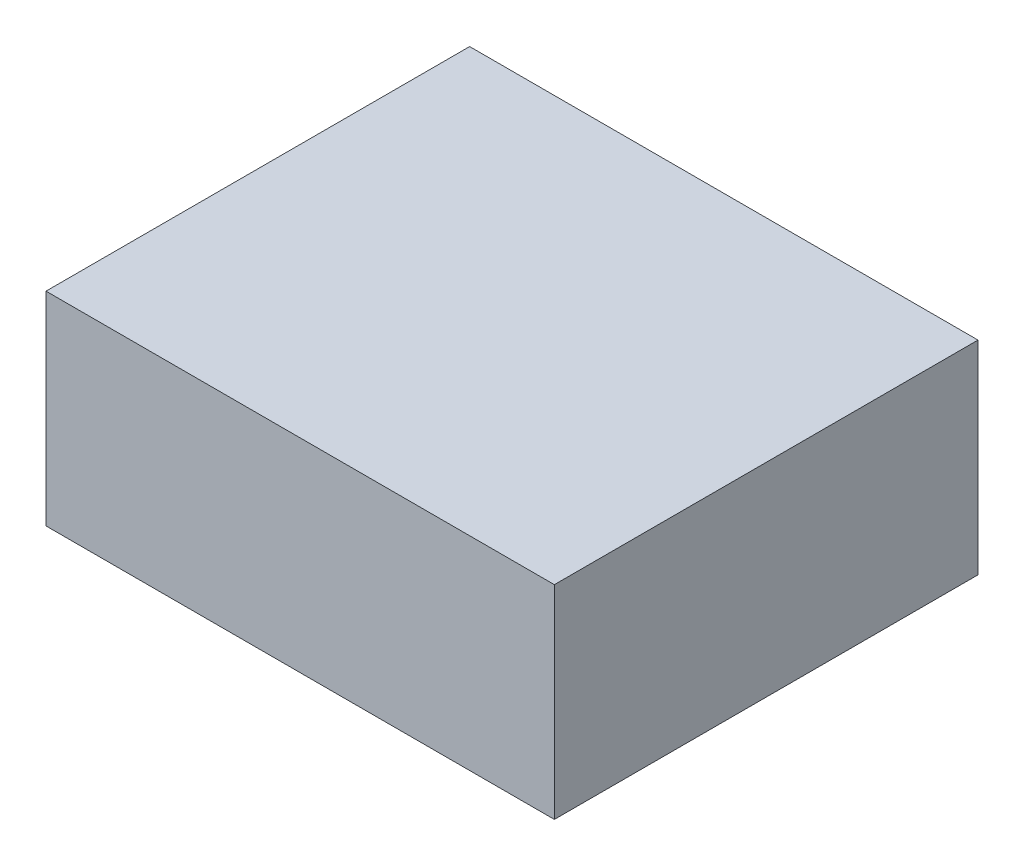
ISO-10303-21;
HEADER;
FILE_DESCRIPTION(('STEP AP214'),'2;1');
FILE_NAME('part.step','',(''),(''),'','','');
FILE_SCHEMA(('AUTOMOTIVE_DESIGN { 1 0 10303 214 1 1 1 1 }'));
ENDSEC;
DATA;
#1=APPLICATION_CONTEXT('core data for automotive mechanical design processes');
#2=APPLICATION_PROTOCOL_DEFINITION('international standard','automotive_design',2000,#1);
#3=PRODUCT_CONTEXT('',#1,'mechanical');
#4=PRODUCT('Part','Part','',(#3));
#5=PRODUCT_RELATED_PRODUCT_CATEGORY('part','',(#4));
#6=PRODUCT_DEFINITION_FORMATION('','',#4);
#7=PRODUCT_DEFINITION_CONTEXT('part definition',#1,'design');
#8=PRODUCT_DEFINITION('design','',#6,#7);
#9=PRODUCT_DEFINITION_SHAPE('','',#8);
#10=(LENGTH_UNIT() NAMED_UNIT(*) SI_UNIT(.MILLI.,.METRE.));
#11=(NAMED_UNIT(*) PLANE_ANGLE_UNIT() SI_UNIT($,.RADIAN.));
#12=(NAMED_UNIT(*) SI_UNIT($,.STERADIAN.) SOLID_ANGLE_UNIT());
#13=UNCERTAINTY_MEASURE_WITH_UNIT(LENGTH_MEASURE(1.E-05),#10,'distance_accuracy_value','');
#14=(GEOMETRIC_REPRESENTATION_CONTEXT(3) GLOBAL_UNCERTAINTY_ASSIGNED_CONTEXT((#13)) GLOBAL_UNIT_ASSIGNED_CONTEXT((#10,
#11,#12)) REPRESENTATION_CONTEXT('',''));
#15=CARTESIAN_POINT('',(0.,0.,0.));
#16=DIRECTION('',(0.,0.,1.));
#17=DIRECTION('',(1.,0.,0.));
#18=AXIS2_PLACEMENT_3D('',#15,#16,#17);
#19=CARTESIAN_POINT('',(150.,1.25,-125.));
#20=DIRECTION('',(-1.,0.,0.));
#21=DIRECTION('',(0.,0.,1.));
#22=AXIS2_PLACEMENT_3D('',#19,#20,#21);
#23=PLANE('',#22);
#24=DIRECTION('',(0.,-1.,0.));
#25=VECTOR('',#24,1.);
#26=CARTESIAN_POINT('',(150.,1.25,125.));
#27=LINE('',#26,#25);
#28=CARTESIAN_POINT('',(150.,120.,125.));
#29=VERTEX_POINT('',#28);
#30=CARTESIAN_POINT('',(150.,0.,125.));
#31=VERTEX_POINT('',#30);
#32=EDGE_CURVE('E187',#29,#31,#27,.T.);
#33=ORIENTED_EDGE('',*,*,#32,.T.);
#34=DIRECTION('',(0.,0.,-1.));
#35=VECTOR('',#34,1.);
#36=CARTESIAN_POINT('',(150.,0.,-125.));
#37=LINE('',#36,#35);
#38=CARTESIAN_POINT('',(150.,0.,-125.));
#39=VERTEX_POINT('',#38);
#40=EDGE_CURVE('E171',#31,#39,#37,.T.);
#41=ORIENTED_EDGE('',*,*,#40,.T.);
#42=DIRECTION('',(0.,-1.,0.));
#43=VECTOR('',#42,1.);
#44=CARTESIAN_POINT('',(150.,1.25,-125.));
#45=LINE('',#44,#43);
#46=CARTESIAN_POINT('',(150.,120.,-125.));
#47=VERTEX_POINT('',#46);
#48=EDGE_CURVE('E57',#47,#39,#45,.T.);
#49=ORIENTED_EDGE('',*,*,#48,.F.);
#50=DIRECTION('',(0.,0.,-1.));
#51=VECTOR('',#50,1.);
#52=CARTESIAN_POINT('',(150.,120.,125.));
#53=LINE('',#52,#51);
#54=EDGE_CURVE('E147',#29,#47,#53,.T.);
#55=ORIENTED_EDGE('',*,*,#54,.F.);
#56=EDGE_LOOP('',(#33,#41,#49,#55));
#57=FACE_BOUND('',#56,.T.);
#58=ADVANCED_FACE('F48',(#57),#23,.F.);
#59=CARTESIAN_POINT('',(-150.,1.25,-125.));
#60=DIRECTION('',(0.,0.,1.));
#61=DIRECTION('',(1.,0.,0.));
#62=AXIS2_PLACEMENT_3D('',#59,#60,#61);
#63=PLANE('',#62);
#64=ORIENTED_EDGE('',*,*,#48,.T.);
#65=DIRECTION('',(-1.,0.,0.));
#66=VECTOR('',#65,1.);
#67=CARTESIAN_POINT('',(-150.,0.,-125.));
#68=LINE('',#67,#66);
#69=CARTESIAN_POINT('',(-150.,0.,-125.));
#70=VERTEX_POINT('',#69);
#71=EDGE_CURVE('E175',#39,#70,#68,.T.);
#72=ORIENTED_EDGE('',*,*,#71,.T.);
#73=DIRECTION('',(0.,-1.,0.));
#74=VECTOR('',#73,1.);
#75=CARTESIAN_POINT('',(-150.,1.25,-125.));
#76=LINE('',#75,#74);
#77=CARTESIAN_POINT('',(-150.,120.,-125.));
#78=VERTEX_POINT('',#77);
#79=EDGE_CURVE('E193',#78,#70,#76,.T.);
#80=ORIENTED_EDGE('',*,*,#79,.F.);
#81=DIRECTION('',(-1.,0.,0.));
#82=VECTOR('',#81,1.);
#83=CARTESIAN_POINT('',(150.,120.,-125.));
#84=LINE('',#83,#82);
#85=EDGE_CURVE('E151',#47,#78,#84,.T.);
#86=ORIENTED_EDGE('',*,*,#85,.F.);
#87=EDGE_LOOP('',(#64,#72,#80,#86));
#88=FACE_BOUND('',#87,.T.);
#89=ADVANCED_FACE('F199',(#88),#63,.F.);
#90=CARTESIAN_POINT('',(-150.,1.25,-125.));
#91=DIRECTION('',(1.,0.,0.));
#92=DIRECTION('',(0.,0.,-1.));
#93=AXIS2_PLACEMENT_3D('',#90,#91,#92);
#94=PLANE('',#93);
#95=ORIENTED_EDGE('',*,*,#79,.T.);
#96=DIRECTION('',(0.,0.,1.));
#97=VECTOR('',#96,1.);
#98=CARTESIAN_POINT('',(-150.,0.,-125.));
#99=LINE('',#98,#97);
#100=CARTESIAN_POINT('',(-150.,0.,125.));
#101=VERTEX_POINT('',#100);
#102=EDGE_CURVE('E179',#70,#101,#99,.T.);
#103=ORIENTED_EDGE('',*,*,#102,.T.);
#104=DIRECTION('',(0.,-1.,0.));
#105=VECTOR('',#104,1.);
#106=CARTESIAN_POINT('',(-150.,1.25,125.));
#107=LINE('',#106,#105);
#108=CARTESIAN_POINT('',(-150.,120.,125.));
#109=VERTEX_POINT('',#108);
#110=EDGE_CURVE('E190',#109,#101,#107,.T.);
#111=ORIENTED_EDGE('',*,*,#110,.F.);
#112=DIRECTION('',(0.,0.,1.));
#113=VECTOR('',#112,1.);
#114=CARTESIAN_POINT('',(-150.,120.,-125.));
#115=LINE('',#114,#113);
#116=EDGE_CURVE('E155',#78,#109,#115,.T.);
#117=ORIENTED_EDGE('',*,*,#116,.F.);
#118=EDGE_LOOP('',(#95,#103,#111,#117));
#119=FACE_BOUND('',#118,.T.);
#120=ADVANCED_FACE('F212',(#119),#94,.F.);
#121=CARTESIAN_POINT('',(-150.,1.25,125.));
#122=DIRECTION('',(0.,0.,-1.));
#123=DIRECTION('',(-1.,0.,0.));
#124=AXIS2_PLACEMENT_3D('',#121,#122,#123);
#125=PLANE('',#124);
#126=ORIENTED_EDGE('',*,*,#110,.T.);
#127=DIRECTION('',(1.,0.,0.));
#128=VECTOR('',#127,1.);
#129=CARTESIAN_POINT('',(-150.,0.,125.));
#130=LINE('',#129,#128);
#131=EDGE_CURVE('E183',#101,#31,#130,.T.);
#132=ORIENTED_EDGE('',*,*,#131,.T.);
#133=ORIENTED_EDGE('',*,*,#32,.F.);
#134=DIRECTION('',(1.,0.,0.));
#135=VECTOR('',#134,1.);
#136=CARTESIAN_POINT('',(-150.,120.,125.));
#137=LINE('',#136,#135);
#138=EDGE_CURVE('E143',#109,#29,#137,.T.);
#139=ORIENTED_EDGE('',*,*,#138,.F.);
#140=EDGE_LOOP('',(#126,#132,#133,#139));
#141=FACE_BOUND('',#140,.T.);
#142=ADVANCED_FACE('F209',(#141),#125,.F.);
#143=CARTESIAN_POINT('',(0.,0.,0.));
#144=DIRECTION('',(0.,1.,0.));
#145=DIRECTION('',(0.,0.,1.));
#146=AXIS2_PLACEMENT_3D('',#143,#144,#145);
#147=PLANE('',#146);
#148=ORIENTED_EDGE('',*,*,#40,.F.);
#149=ORIENTED_EDGE('',*,*,#131,.F.);
#150=ORIENTED_EDGE('',*,*,#102,.F.);
#151=ORIENTED_EDGE('',*,*,#71,.F.);
#152=EDGE_LOOP('',(#148,#149,#150,#151));
#153=FACE_BOUND('',#152,.T.);
#154=ADVANCED_FACE('F205',(#153),#147,.F.);
#155=CARTESIAN_POINT('',(0.,120.,0.));
#156=DIRECTION('',(0.,1.,0.));
#157=DIRECTION('',(0.,0.,1.));
#158=AXIS2_PLACEMENT_3D('',#155,#156,#157);
#159=PLANE('',#158);
#160=ORIENTED_EDGE('',*,*,#138,.T.);
#161=ORIENTED_EDGE('',*,*,#54,.T.);
#162=ORIENTED_EDGE('',*,*,#85,.T.);
#163=ORIENTED_EDGE('',*,*,#116,.T.);
#164=EDGE_LOOP('',(#160,#161,#162,#163));
#165=FACE_BOUND('',#164,.T.);
#166=ADVANCED_FACE('F214',(#165),#159,.T.);
#167=CLOSED_SHELL('',(#58,#89,#120,#142,#154,#166));
#168=CARTESIAN_POINT('',(0.,1.25,0.));
#169=DIRECTION('',(0.,1.,0.));
#170=DIRECTION('',(0.,0.,1.));
#171=AXIS2_PLACEMENT_3D('',#168,#169,#170);
#172=PLANE('',#171);
#173=DIRECTION('',(0.,0.,1.));
#174=VECTOR('',#173,1.);
#175=CARTESIAN_POINT('',(148.75,1.25,0.));
#176=LINE('',#175,#174);
#177=CARTESIAN_POINT('',(148.75,1.25,-123.75));
#178=VERTEX_POINT('',#177);
#179=CARTESIAN_POINT('',(148.75,1.25,123.75));
#180=VERTEX_POINT('',#179);
#181=EDGE_CURVE('E168',#178,#180,#176,.T.);
#182=ORIENTED_EDGE('',*,*,#181,.F.);
#183=DIRECTION('',(1.,0.,0.));
#184=VECTOR('',#183,1.);
#185=CARTESIAN_POINT('',(0.,1.25,-123.75));
#186=LINE('',#185,#184);
#187=CARTESIAN_POINT('',(-148.75,1.25,-123.75));
#188=VERTEX_POINT('',#187);
#189=EDGE_CURVE('E164',#188,#178,#186,.T.);
#190=ORIENTED_EDGE('',*,*,#189,.F.);
#191=DIRECTION('',(0.,0.,-1.));
#192=VECTOR('',#191,1.);
#193=CARTESIAN_POINT('',(-148.75,1.25,0.));
#194=LINE('',#193,#192);
#195=CARTESIAN_POINT('',(-148.75,1.25,123.75));
#196=VERTEX_POINT('',#195);
#197=EDGE_CURVE('E161',#196,#188,#194,.T.);
#198=ORIENTED_EDGE('',*,*,#197,.F.);
#199=DIRECTION('',(-1.,0.,0.));
#200=VECTOR('',#199,1.);
#201=CARTESIAN_POINT('',(0.,1.25,123.75));
#202=LINE('',#201,#200);
#203=EDGE_CURVE('E131',#180,#196,#202,.T.);
#204=ORIENTED_EDGE('',*,*,#203,.F.);
#205=EDGE_LOOP('',(#182,#190,#198,#204));
#206=FACE_BOUND('',#205,.T.);
#207=ADVANCED_FACE('F235',(#206),#172,.T.);
#208=CARTESIAN_POINT('',(-148.75,120.,123.75));
#209=DIRECTION('',(0.,0.,-1.));
#210=DIRECTION('',(-1.,0.,0.));
#211=AXIS2_PLACEMENT_3D('',#208,#209,#210);
#212=PLANE('',#211);
#213=DIRECTION('',(0.,-1.,0.));
#214=VECTOR('',#213,1.);
#215=CARTESIAN_POINT('',(-148.75,120.,123.75));
#216=LINE('',#215,#214);
#217=CARTESIAN_POINT('',(-148.75,118.75,123.75));
#218=VERTEX_POINT('',#217);
#219=EDGE_CURVE('E122',#218,#196,#216,.T.);
#220=ORIENTED_EDGE('',*,*,#219,.F.);
#221=DIRECTION('',(1.,0.,0.));
#222=VECTOR('',#221,1.);
#223=CARTESIAN_POINT('',(-148.75,118.75,123.75));
#224=LINE('',#223,#222);
#225=CARTESIAN_POINT('',(148.75,118.75,123.75));
#226=VERTEX_POINT('',#225);
#227=EDGE_CURVE('E11',#218,#226,#224,.T.);
#228=ORIENTED_EDGE('',*,*,#227,.T.);
#229=DIRECTION('',(0.,-1.,0.));
#230=VECTOR('',#229,1.);
#231=CARTESIAN_POINT('',(148.75,120.,123.75));
#232=LINE('',#231,#230);
#233=EDGE_CURVE('E133',#226,#180,#232,.T.);
#234=ORIENTED_EDGE('',*,*,#233,.T.);
#235=ORIENTED_EDGE('',*,*,#203,.T.);
#236=EDGE_LOOP('',(#220,#228,#234,#235));
#237=FACE_BOUND('',#236,.T.);
#238=ADVANCED_FACE('F129',(#237),#212,.T.);
#239=CARTESIAN_POINT('',(-148.75,120.,-123.75));
#240=DIRECTION('',(1.,0.,0.));
#241=DIRECTION('',(0.,0.,-1.));
#242=AXIS2_PLACEMENT_3D('',#239,#240,#241);
#243=PLANE('',#242);
#244=DIRECTION('',(0.,-1.,0.));
#245=VECTOR('',#244,1.);
#246=CARTESIAN_POINT('',(-148.75,120.,-123.75));
#247=LINE('',#246,#245);
#248=CARTESIAN_POINT('',(-148.75,118.75,-123.75));
#249=VERTEX_POINT('',#248);
#250=EDGE_CURVE('E124',#249,#188,#247,.T.);
#251=ORIENTED_EDGE('',*,*,#250,.F.);
#252=DIRECTION('',(0.,0.,1.));
#253=VECTOR('',#252,1.);
#254=CARTESIAN_POINT('',(-148.75,118.75,-123.75));
#255=LINE('',#254,#253);
#256=EDGE_CURVE('E113',#249,#218,#255,.T.);
#257=ORIENTED_EDGE('',*,*,#256,.T.);
#258=ORIENTED_EDGE('',*,*,#219,.T.);
#259=ORIENTED_EDGE('',*,*,#197,.T.);
#260=EDGE_LOOP('',(#251,#257,#258,#259));
#261=FACE_BOUND('',#260,.T.);
#262=ADVANCED_FACE('F120',(#261),#243,.T.);
#263=CARTESIAN_POINT('',(-148.75,120.,-123.75));
#264=DIRECTION('',(0.,0.,1.));
#265=DIRECTION('',(1.,0.,0.));
#266=AXIS2_PLACEMENT_3D('',#263,#264,#265);
#267=PLANE('',#266);
#268=DIRECTION('',(0.,-1.,0.));
#269=VECTOR('',#268,1.);
#270=CARTESIAN_POINT('',(148.75,120.,-123.75));
#271=LINE('',#270,#269);
#272=CARTESIAN_POINT('',(148.75,118.75,-123.75));
#273=VERTEX_POINT('',#272);
#274=EDGE_CURVE('E70',#273,#178,#271,.T.);
#275=ORIENTED_EDGE('',*,*,#274,.F.);
#276=DIRECTION('',(-1.,0.,0.));
#277=VECTOR('',#276,1.);
#278=CARTESIAN_POINT('',(-148.75,118.75,-123.75));
#279=LINE('',#278,#277);
#280=EDGE_CURVE('E126',#273,#249,#279,.T.);
#281=ORIENTED_EDGE('',*,*,#280,.T.);
#282=ORIENTED_EDGE('',*,*,#250,.T.);
#283=ORIENTED_EDGE('',*,*,#189,.T.);
#284=EDGE_LOOP('',(#275,#281,#282,#283));
#285=FACE_BOUND('',#284,.T.);
#286=ADVANCED_FACE('F243',(#285),#267,.T.);
#287=CARTESIAN_POINT('',(148.75,120.,-123.75));
#288=DIRECTION('',(-1.,0.,0.));
#289=DIRECTION('',(0.,0.,1.));
#290=AXIS2_PLACEMENT_3D('',#287,#288,#289);
#291=PLANE('',#290);
#292=ORIENTED_EDGE('',*,*,#233,.F.);
#293=DIRECTION('',(0.,0.,-1.));
#294=VECTOR('',#293,1.);
#295=CARTESIAN_POINT('',(148.75,118.75,-123.75));
#296=LINE('',#295,#294);
#297=EDGE_CURVE('E64',#226,#273,#296,.T.);
#298=ORIENTED_EDGE('',*,*,#297,.T.);
#299=ORIENTED_EDGE('',*,*,#274,.T.);
#300=ORIENTED_EDGE('',*,*,#181,.T.);
#301=EDGE_LOOP('',(#292,#298,#299,#300));
#302=FACE_BOUND('',#301,.T.);
#303=ADVANCED_FACE('F247',(#302),#291,.T.);
#304=CARTESIAN_POINT('',(0.,118.75,0.));
#305=DIRECTION('',(0.,1.,0.));
#306=DIRECTION('',(0.,0.,1.));
#307=AXIS2_PLACEMENT_3D('',#304,#305,#306);
#308=PLANE('',#307);
#309=ORIENTED_EDGE('',*,*,#297,.F.);
#310=ORIENTED_EDGE('',*,*,#227,.F.);
#311=ORIENTED_EDGE('',*,*,#256,.F.);
#312=ORIENTED_EDGE('',*,*,#280,.F.);
#313=EDGE_LOOP('',(#309,#310,#311,#312));
#314=FACE_BOUND('',#313,.T.);
#315=ADVANCED_FACE('F112',(#314),#308,.F.);
#316=CLOSED_SHELL('',(#207,#238,#262,#286,#303,#315));
#317=ORIENTED_CLOSED_SHELL('',*,#316,.T.);
#318=BREP_WITH_VOIDS('B2',#167,(#317));
#319=ADVANCED_BREP_SHAPE_REPRESENTATION('',(#18,#318),#14);
#320=SHAPE_DEFINITION_REPRESENTATION(#9,#319);
ENDSEC;
END-ISO-10303-21;
